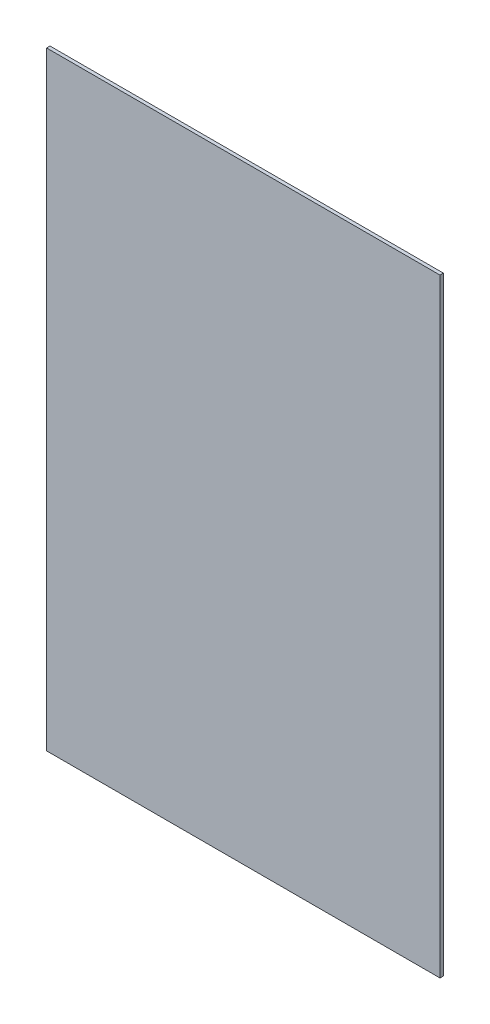
ISO-10303-21;
HEADER;
FILE_DESCRIPTION(('STEP AP214'),'2;1');
FILE_NAME('part.step','',(''),(''),'','','');
FILE_SCHEMA(('AUTOMOTIVE_DESIGN { 1 0 10303 214 1 1 1 1 }'));
ENDSEC;
DATA;
#1=APPLICATION_CONTEXT('core data for automotive mechanical design processes');
#2=APPLICATION_PROTOCOL_DEFINITION('international standard','automotive_design',2000,#1);
#3=PRODUCT_CONTEXT('',#1,'mechanical');
#4=PRODUCT('Part','Part','',(#3));
#5=PRODUCT_RELATED_PRODUCT_CATEGORY('part','',(#4));
#6=PRODUCT_DEFINITION_FORMATION('','',#4);
#7=PRODUCT_DEFINITION_CONTEXT('part definition',#1,'design');
#8=PRODUCT_DEFINITION('design','',#6,#7);
#9=PRODUCT_DEFINITION_SHAPE('','',#8);
#10=(LENGTH_UNIT() NAMED_UNIT(*) SI_UNIT(.MILLI.,.METRE.));
#11=(NAMED_UNIT(*) PLANE_ANGLE_UNIT() SI_UNIT($,.RADIAN.));
#12=(NAMED_UNIT(*) SI_UNIT($,.STERADIAN.) SOLID_ANGLE_UNIT());
#13=UNCERTAINTY_MEASURE_WITH_UNIT(LENGTH_MEASURE(1.E-05),#10,'distance_accuracy_value','');
#14=(GEOMETRIC_REPRESENTATION_CONTEXT(3) GLOBAL_UNCERTAINTY_ASSIGNED_CONTEXT((#13)) GLOBAL_UNIT_ASSIGNED_CONTEXT((#10,
#11,#12)) REPRESENTATION_CONTEXT('',''));
#15=CARTESIAN_POINT('',(0.,0.,0.));
#16=DIRECTION('',(0.,0.,1.));
#17=DIRECTION('',(1.,0.,0.));
#18=AXIS2_PLACEMENT_3D('',#15,#16,#17);
#19=CARTESIAN_POINT('',(-184.15,285.,3.175));
#20=DIRECTION('',(1.,0.,0.));
#21=DIRECTION('',(0.,0.,-1.));
#22=AXIS2_PLACEMENT_3D('',#19,#20,#21);
#23=PLANE('',#22);
#24=DIRECTION('',(0.,-1.,0.));
#25=VECTOR('',#24,1.);
#26=CARTESIAN_POINT('',(-184.15,285.,0.));
#27=LINE('',#26,#25);
#28=CARTESIAN_POINT('',(-184.15,285.,0.));
#29=VERTEX_POINT('',#28);
#30=CARTESIAN_POINT('',(-184.15,-285.,0.));
#31=VERTEX_POINT('',#30);
#32=EDGE_CURVE('E107',#29,#31,#27,.T.);
#33=ORIENTED_EDGE('',*,*,#32,.T.);
#34=DIRECTION('',(0.,0.,-1.));
#35=VECTOR('',#34,1.);
#36=CARTESIAN_POINT('',(-184.15,-285.,3.175));
#37=LINE('',#36,#35);
#38=CARTESIAN_POINT('',(-184.15,-285.,3.175));
#39=VERTEX_POINT('',#38);
#40=EDGE_CURVE('E11',#39,#31,#37,.T.);
#41=ORIENTED_EDGE('',*,*,#40,.F.);
#42=DIRECTION('',(0.,-1.,0.));
#43=VECTOR('',#42,1.);
#44=CARTESIAN_POINT('',(-184.15,285.,3.175));
#45=LINE('',#44,#43);
#46=CARTESIAN_POINT('',(-184.15,285.,3.175));
#47=VERTEX_POINT('',#46);
#48=EDGE_CURVE('E91',#47,#39,#45,.T.);
#49=ORIENTED_EDGE('',*,*,#48,.F.);
#50=DIRECTION('',(0.,0.,-1.));
#51=VECTOR('',#50,1.);
#52=CARTESIAN_POINT('',(-184.15,285.,3.175));
#53=LINE('',#52,#51);
#54=EDGE_CURVE('E103',#47,#29,#53,.T.);
#55=ORIENTED_EDGE('',*,*,#54,.T.);
#56=EDGE_LOOP('',(#33,#41,#49,#55));
#57=FACE_BOUND('',#56,.T.);
#58=ADVANCED_FACE('F39',(#57),#23,.F.);
#59=CARTESIAN_POINT('',(-184.15,-285.,3.175));
#60=DIRECTION('',(0.,1.,0.));
#61=DIRECTION('',(0.,0.,1.));
#62=AXIS2_PLACEMENT_3D('',#59,#60,#61);
#63=PLANE('',#62);
#64=DIRECTION('',(1.,0.,0.));
#65=VECTOR('',#64,1.);
#66=CARTESIAN_POINT('',(-184.15,-285.,0.));
#67=LINE('',#66,#65);
#68=CARTESIAN_POINT('',(184.15,-285.,0.));
#69=VERTEX_POINT('',#68);
#70=EDGE_CURVE('E96',#31,#69,#67,.T.);
#71=ORIENTED_EDGE('',*,*,#70,.T.);
#72=DIRECTION('',(0.,0.,-1.));
#73=VECTOR('',#72,1.);
#74=CARTESIAN_POINT('',(184.15,-285.,3.175));
#75=LINE('',#74,#73);
#76=CARTESIAN_POINT('',(184.15,-285.,3.175));
#77=VERTEX_POINT('',#76);
#78=EDGE_CURVE('E48',#77,#69,#75,.T.);
#79=ORIENTED_EDGE('',*,*,#78,.F.);
#80=DIRECTION('',(1.,0.,0.));
#81=VECTOR('',#80,1.);
#82=CARTESIAN_POINT('',(-184.15,-285.,3.175));
#83=LINE('',#82,#81);
#84=EDGE_CURVE('E86',#39,#77,#83,.T.);
#85=ORIENTED_EDGE('',*,*,#84,.F.);
#86=ORIENTED_EDGE('',*,*,#40,.T.);
#87=EDGE_LOOP('',(#71,#79,#85,#86));
#88=FACE_BOUND('',#87,.T.);
#89=ADVANCED_FACE('F95',(#88),#63,.F.);
#90=CARTESIAN_POINT('',(184.15,285.,3.175));
#91=DIRECTION('',(-1.,0.,0.));
#92=DIRECTION('',(0.,0.,1.));
#93=AXIS2_PLACEMENT_3D('',#90,#91,#92);
#94=PLANE('',#93);
#95=DIRECTION('',(0.,1.,0.));
#96=VECTOR('',#95,1.);
#97=CARTESIAN_POINT('',(184.15,285.,0.));
#98=LINE('',#97,#96);
#99=CARTESIAN_POINT('',(184.15,285.,0.));
#100=VERTEX_POINT('',#99);
#101=EDGE_CURVE('E73',#69,#100,#98,.T.);
#102=ORIENTED_EDGE('',*,*,#101,.T.);
#103=DIRECTION('',(0.,0.,-1.));
#104=VECTOR('',#103,1.);
#105=CARTESIAN_POINT('',(184.15,285.,3.175));
#106=LINE('',#105,#104);
#107=CARTESIAN_POINT('',(184.15,285.,3.175));
#108=VERTEX_POINT('',#107);
#109=EDGE_CURVE('E98',#108,#100,#106,.T.);
#110=ORIENTED_EDGE('',*,*,#109,.F.);
#111=DIRECTION('',(0.,1.,0.));
#112=VECTOR('',#111,1.);
#113=CARTESIAN_POINT('',(184.15,285.,3.175));
#114=LINE('',#113,#112);
#115=EDGE_CURVE('E89',#77,#108,#114,.T.);
#116=ORIENTED_EDGE('',*,*,#115,.F.);
#117=ORIENTED_EDGE('',*,*,#78,.T.);
#118=EDGE_LOOP('',(#102,#110,#116,#117));
#119=FACE_BOUND('',#118,.T.);
#120=ADVANCED_FACE('F99',(#119),#94,.F.);
#121=CARTESIAN_POINT('',(-184.15,285.,3.175));
#122=DIRECTION('',(0.,-1.,0.));
#123=DIRECTION('',(0.,0.,-1.));
#124=AXIS2_PLACEMENT_3D('',#121,#122,#123);
#125=PLANE('',#124);
#126=DIRECTION('',(-1.,0.,0.));
#127=VECTOR('',#126,1.);
#128=CARTESIAN_POINT('',(-184.15,285.,0.));
#129=LINE('',#128,#127);
#130=EDGE_CURVE('E79',#100,#29,#129,.T.);
#131=ORIENTED_EDGE('',*,*,#130,.T.);
#132=ORIENTED_EDGE('',*,*,#54,.F.);
#133=DIRECTION('',(-1.,0.,0.));
#134=VECTOR('',#133,1.);
#135=CARTESIAN_POINT('',(-184.15,285.,3.175));
#136=LINE('',#135,#134);
#137=EDGE_CURVE('E56',#108,#47,#136,.T.);
#138=ORIENTED_EDGE('',*,*,#137,.F.);
#139=ORIENTED_EDGE('',*,*,#109,.T.);
#140=EDGE_LOOP('',(#131,#132,#138,#139));
#141=FACE_BOUND('',#140,.T.);
#142=ADVANCED_FACE('F120',(#141),#125,.F.);
#143=CARTESIAN_POINT('',(0.,0.,3.175));
#144=DIRECTION('',(0.,0.,1.));
#145=DIRECTION('',(1.,0.,0.));
#146=AXIS2_PLACEMENT_3D('',#143,#144,#145);
#147=PLANE('',#146);
#148=ORIENTED_EDGE('',*,*,#48,.T.);
#149=ORIENTED_EDGE('',*,*,#84,.T.);
#150=ORIENTED_EDGE('',*,*,#115,.T.);
#151=ORIENTED_EDGE('',*,*,#137,.T.);
#152=EDGE_LOOP('',(#148,#149,#150,#151));
#153=FACE_BOUND('',#152,.T.);
#154=ADVANCED_FACE('F87',(#153),#147,.T.);
#155=CARTESIAN_POINT('',(0.,0.,0.));
#156=DIRECTION('',(0.,0.,1.));
#157=DIRECTION('',(1.,0.,0.));
#158=AXIS2_PLACEMENT_3D('',#155,#156,#157);
#159=PLANE('',#158);
#160=ORIENTED_EDGE('',*,*,#32,.F.);
#161=ORIENTED_EDGE('',*,*,#130,.F.);
#162=ORIENTED_EDGE('',*,*,#101,.F.);
#163=ORIENTED_EDGE('',*,*,#70,.F.);
#164=EDGE_LOOP('',(#160,#161,#162,#163));
#165=FACE_BOUND('',#164,.T.);
#166=ADVANCED_FACE('F123',(#165),#159,.F.);
#167=CLOSED_SHELL('',(#58,#89,#120,#142,#154,#166));
#168=MANIFOLD_SOLID_BREP('B2',#167);
#169=ADVANCED_BREP_SHAPE_REPRESENTATION('',(#18,#168),#14);
#170=SHAPE_DEFINITION_REPRESENTATION(#9,#169);
ENDSEC;
END-ISO-10303-21;
